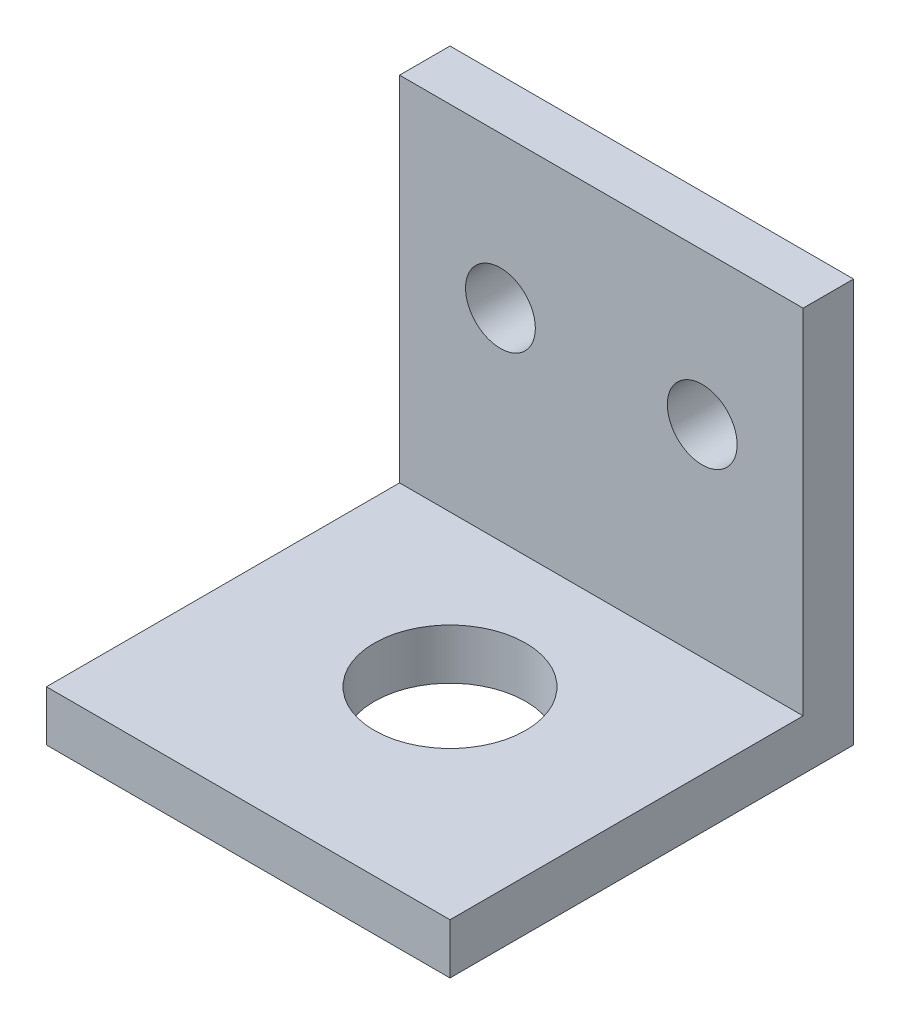
ISO-10303-21;
HEADER;
FILE_DESCRIPTION(('STEP AP214'),'2;1');
FILE_NAME('part.step','',(''),(''),'','','');
FILE_SCHEMA(('AUTOMOTIVE_DESIGN { 1 0 10303 214 1 1 1 1 }'));
ENDSEC;
DATA;
#1=APPLICATION_CONTEXT('core data for automotive mechanical design processes');
#2=APPLICATION_PROTOCOL_DEFINITION('international standard','automotive_design',2000,#1);
#3=PRODUCT_CONTEXT('',#1,'mechanical');
#4=PRODUCT('Part','Part','',(#3));
#5=PRODUCT_RELATED_PRODUCT_CATEGORY('part','',(#4));
#6=PRODUCT_DEFINITION_FORMATION('','',#4);
#7=PRODUCT_DEFINITION_CONTEXT('part definition',#1,'design');
#8=PRODUCT_DEFINITION('design','',#6,#7);
#9=PRODUCT_DEFINITION_SHAPE('','',#8);
#10=(LENGTH_UNIT() NAMED_UNIT(*) SI_UNIT(.MILLI.,.METRE.));
#11=(NAMED_UNIT(*) PLANE_ANGLE_UNIT() SI_UNIT($,.RADIAN.));
#12=(NAMED_UNIT(*) SI_UNIT($,.STERADIAN.) SOLID_ANGLE_UNIT());
#13=UNCERTAINTY_MEASURE_WITH_UNIT(LENGTH_MEASURE(1.E-05),#10,'distance_accuracy_value','');
#14=(GEOMETRIC_REPRESENTATION_CONTEXT(3) GLOBAL_UNCERTAINTY_ASSIGNED_CONTEXT((#13)) GLOBAL_UNIT_ASSIGNED_CONTEXT((#10,
#11,#12)) REPRESENTATION_CONTEXT('',''));
#15=CARTESIAN_POINT('',(0.,0.,0.));
#16=DIRECTION('',(0.,0.,1.));
#17=DIRECTION('',(1.,0.,0.));
#18=AXIS2_PLACEMENT_3D('',#15,#16,#17);
#19=CARTESIAN_POINT('',(-12.7,3.175,12.7));
#20=DIRECTION('',(-1.,0.,0.));
#21=DIRECTION('',(0.,0.,1.));
#22=AXIS2_PLACEMENT_3D('',#19,#20,#21);
#23=PLANE('',#22);
#24=DIRECTION('',(0.,0.,-1.));
#25=VECTOR('',#24,1.);
#26=CARTESIAN_POINT('',(-12.7,3.175,12.7));
#27=LINE('',#26,#25);
#28=CARTESIAN_POINT('',(-12.7,3.175,12.7));
#29=VERTEX_POINT('',#28);
#30=CARTESIAN_POINT('',(-12.7,3.175,-9.525));
#31=VERTEX_POINT('',#30);
#32=EDGE_CURVE('E86',#29,#31,#27,.T.);
#33=ORIENTED_EDGE('',*,*,#32,.T.);
#34=DIRECTION('',(0.,-1.,0.));
#35=VECTOR('',#34,1.);
#36=CARTESIAN_POINT('',(-12.7,25.4,-9.52500000000001));
#37=LINE('',#36,#35);
#38=CARTESIAN_POINT('',(-12.7,25.4,-9.52500000000001));
#39=VERTEX_POINT('',#38);
#40=EDGE_CURVE('E48',#39,#31,#37,.T.);
#41=ORIENTED_EDGE('',*,*,#40,.F.);
#42=DIRECTION('',(0.,0.,-1.));
#43=VECTOR('',#42,1.);
#44=CARTESIAN_POINT('',(-12.7,25.4,-12.7));
#45=LINE('',#44,#43);
#46=CARTESIAN_POINT('',(-12.7,25.4,-12.7));
#47=VERTEX_POINT('',#46);
#48=EDGE_CURVE('E117',#39,#47,#45,.T.);
#49=ORIENTED_EDGE('',*,*,#48,.T.);
#50=DIRECTION('',(0.,-1.,0.));
#51=VECTOR('',#50,1.);
#52=CARTESIAN_POINT('',(-12.7,3.175,-12.7));
#53=LINE('',#52,#51);
#54=CARTESIAN_POINT('',(-12.7,0.,-12.7));
#55=VERTEX_POINT('',#54);
#56=EDGE_CURVE('E35',#47,#55,#53,.T.);
#57=ORIENTED_EDGE('',*,*,#56,.T.);
#58=DIRECTION('',(0.,0.,-1.));
#59=VECTOR('',#58,1.);
#60=CARTESIAN_POINT('',(-12.7,0.,12.7));
#61=LINE('',#60,#59);
#62=CARTESIAN_POINT('',(-12.7,0.,12.7));
#63=VERTEX_POINT('',#62);
#64=EDGE_CURVE('E83',#63,#55,#61,.T.);
#65=ORIENTED_EDGE('',*,*,#64,.F.);
#66=DIRECTION('',(0.,-1.,0.));
#67=VECTOR('',#66,1.);
#68=CARTESIAN_POINT('',(-12.7,3.175,12.7));
#69=LINE('',#68,#67);
#70=EDGE_CURVE('E11',#29,#63,#69,.T.);
#71=ORIENTED_EDGE('',*,*,#70,.F.);
#72=EDGE_LOOP('',(#33,#41,#49,#57,#65,#71));
#73=FACE_BOUND('',#72,.T.);
#74=ADVANCED_FACE('F32',(#73),#23,.T.);
#75=CARTESIAN_POINT('',(-12.7,3.175,12.7));
#76=DIRECTION('',(0.,0.,-1.));
#77=DIRECTION('',(-1.,0.,0.));
#78=AXIS2_PLACEMENT_3D('',#75,#76,#77);
#79=PLANE('',#78);
#80=DIRECTION('',(1.,0.,0.));
#81=VECTOR('',#80,1.);
#82=CARTESIAN_POINT('',(-12.7,0.,12.7));
#83=LINE('',#82,#81);
#84=CARTESIAN_POINT('',(12.7,0.,12.7));
#85=VERTEX_POINT('',#84);
#86=EDGE_CURVE('E75',#63,#85,#83,.T.);
#87=ORIENTED_EDGE('',*,*,#86,.T.);
#88=DIRECTION('',(0.,-1.,0.));
#89=VECTOR('',#88,1.);
#90=CARTESIAN_POINT('',(12.7,3.175,12.7));
#91=LINE('',#90,#89);
#92=CARTESIAN_POINT('',(12.7,3.175,12.7));
#93=VERTEX_POINT('',#92);
#94=EDGE_CURVE('E40',#93,#85,#91,.T.);
#95=ORIENTED_EDGE('',*,*,#94,.F.);
#96=DIRECTION('',(1.,0.,0.));
#97=VECTOR('',#96,1.);
#98=CARTESIAN_POINT('',(-12.7,3.175,12.7));
#99=LINE('',#98,#97);
#100=EDGE_CURVE('E77',#29,#93,#99,.T.);
#101=ORIENTED_EDGE('',*,*,#100,.F.);
#102=ORIENTED_EDGE('',*,*,#70,.T.);
#103=EDGE_LOOP('',(#87,#95,#101,#102));
#104=FACE_BOUND('',#103,.T.);
#105=ADVANCED_FACE('F73',(#104),#79,.F.);
#106=CARTESIAN_POINT('',(12.7,3.175,12.7));
#107=DIRECTION('',(-1.,0.,0.));
#108=DIRECTION('',(0.,0.,1.));
#109=AXIS2_PLACEMENT_3D('',#106,#107,#108);
#110=PLANE('',#109);
#111=DIRECTION('',(0.,0.,-1.));
#112=VECTOR('',#111,1.);
#113=CARTESIAN_POINT('',(12.7,0.,12.7));
#114=LINE('',#113,#112);
#115=CARTESIAN_POINT('',(12.7,0.,-12.7));
#116=VERTEX_POINT('',#115);
#117=EDGE_CURVE('E85',#85,#116,#114,.T.);
#118=ORIENTED_EDGE('',*,*,#117,.T.);
#119=DIRECTION('',(0.,-1.,0.));
#120=VECTOR('',#119,1.);
#121=CARTESIAN_POINT('',(12.7,3.175,-12.7));
#122=LINE('',#121,#120);
#123=CARTESIAN_POINT('',(12.7,25.4,-12.7));
#124=VERTEX_POINT('',#123);
#125=EDGE_CURVE('E100',#124,#116,#122,.T.);
#126=ORIENTED_EDGE('',*,*,#125,.F.);
#127=DIRECTION('',(0.,0.,1.));
#128=VECTOR('',#127,1.);
#129=CARTESIAN_POINT('',(12.7,25.4,-12.7));
#130=LINE('',#129,#128);
#131=CARTESIAN_POINT('',(12.7,25.4,-9.525));
#132=VERTEX_POINT('',#131);
#133=EDGE_CURVE('E121',#124,#132,#130,.T.);
#134=ORIENTED_EDGE('',*,*,#133,.T.);
#135=DIRECTION('',(0.,-1.,0.));
#136=VECTOR('',#135,1.);
#137=CARTESIAN_POINT('',(12.7,25.4,-9.525));
#138=LINE('',#137,#136);
#139=CARTESIAN_POINT('',(12.7,3.175,-9.525));
#140=VERTEX_POINT('',#139);
#141=EDGE_CURVE('E111',#132,#140,#138,.T.);
#142=ORIENTED_EDGE('',*,*,#141,.T.);
#143=DIRECTION('',(0.,0.,-1.));
#144=VECTOR('',#143,1.);
#145=CARTESIAN_POINT('',(12.7,3.175,12.7));
#146=LINE('',#145,#144);
#147=EDGE_CURVE('E105',#93,#140,#146,.T.);
#148=ORIENTED_EDGE('',*,*,#147,.F.);
#149=ORIENTED_EDGE('',*,*,#94,.T.);
#150=EDGE_LOOP('',(#118,#126,#134,#142,#148,#149));
#151=FACE_BOUND('',#150,.T.);
#152=ADVANCED_FACE('F164',(#151),#110,.F.);
#153=CARTESIAN_POINT('',(-12.7,3.175,-12.7));
#154=DIRECTION('',(0.,0.,-1.));
#155=DIRECTION('',(-1.,0.,0.));
#156=AXIS2_PLACEMENT_3D('',#153,#154,#155);
#157=PLANE('',#156);
#158=CARTESIAN_POINT('',(-6.35,15.875,-12.7));
#159=DIRECTION('',(0.,0.,1.));
#160=DIRECTION('',(1.,0.,0.));
#161=AXIS2_PLACEMENT_3D('',#158,#159,#160);
#162=CIRCLE('',#161,2.1971);
#163=CARTESIAN_POINT('',(-4.1529,15.875,-12.7));
#164=VERTEX_POINT('',#163);
#165=EDGE_CURVE('E128',#164,#164,#162,.T.);
#166=ORIENTED_EDGE('',*,*,#165,.T.);
#167=EDGE_LOOP('',(#166));
#168=FACE_BOUND('',#167,.T.);
#169=CARTESIAN_POINT('',(6.35,15.875,-12.7));
#170=DIRECTION('',(0.,0.,1.));
#171=DIRECTION('',(-1.,0.,0.));
#172=AXIS2_PLACEMENT_3D('',#169,#170,#171);
#173=CIRCLE('',#172,2.1971);
#174=CARTESIAN_POINT('',(4.1529,15.875,-12.7));
#175=VERTEX_POINT('',#174);
#176=EDGE_CURVE('E134',#175,#175,#173,.T.);
#177=ORIENTED_EDGE('',*,*,#176,.T.);
#178=EDGE_LOOP('',(#177));
#179=FACE_BOUND('',#178,.T.);
#180=DIRECTION('',(1.,0.,0.));
#181=VECTOR('',#180,1.);
#182=CARTESIAN_POINT('',(-12.7,0.,-12.7));
#183=LINE('',#182,#181);
#184=EDGE_CURVE('E91',#55,#116,#183,.T.);
#185=ORIENTED_EDGE('',*,*,#184,.F.);
#186=ORIENTED_EDGE('',*,*,#56,.F.);
#187=DIRECTION('',(1.,0.,0.));
#188=VECTOR('',#187,1.);
#189=CARTESIAN_POINT('',(12.7,25.4,-12.7));
#190=LINE('',#189,#188);
#191=EDGE_CURVE('E114',#47,#124,#190,.T.);
#192=ORIENTED_EDGE('',*,*,#191,.T.);
#193=ORIENTED_EDGE('',*,*,#125,.T.);
#194=EDGE_LOOP('',(#185,#186,#192,#193));
#195=FACE_BOUND('',#194,.T.);
#196=ADVANCED_FACE('F143',(#168,#179,#195),#157,.T.);
#197=CARTESIAN_POINT('',(0.,3.175,0.));
#198=DIRECTION('',(0.,-1.,0.));
#199=DIRECTION('',(0.,0.,-1.));
#200=AXIS2_PLACEMENT_3D('',#197,#198,#199);
#201=PLANE('',#200);
#202=CARTESIAN_POINT('',(0.,3.175,0.));
#203=DIRECTION('',(0.,1.,0.));
#204=DIRECTION('',(0.,0.,1.));
#205=AXIS2_PLACEMENT_3D('',#202,#203,#204);
#206=CIRCLE('',#205,4.7625);
#207=CARTESIAN_POINT('',(0.,3.175,4.7625));
#208=VERTEX_POINT('',#207);
#209=EDGE_CURVE('E125',#208,#208,#206,.T.);
#210=ORIENTED_EDGE('',*,*,#209,.F.);
#211=EDGE_LOOP('',(#210));
#212=FACE_BOUND('',#211,.T.);
#213=ORIENTED_EDGE('',*,*,#147,.T.);
#214=DIRECTION('',(-1.,0.,0.));
#215=VECTOR('',#214,1.);
#216=CARTESIAN_POINT('',(0.,3.175,-9.525));
#217=LINE('',#216,#215);
#218=EDGE_CURVE('E92',#140,#31,#217,.T.);
#219=ORIENTED_EDGE('',*,*,#218,.T.);
#220=ORIENTED_EDGE('',*,*,#32,.F.);
#221=ORIENTED_EDGE('',*,*,#100,.T.);
#222=EDGE_LOOP('',(#213,#219,#220,#221));
#223=FACE_BOUND('',#222,.T.);
#224=ADVANCED_FACE('F175',(#212,#223),#201,.F.);
#225=CARTESIAN_POINT('',(0.,0.,0.));
#226=DIRECTION('',(0.,-1.,0.));
#227=DIRECTION('',(0.,0.,-1.));
#228=AXIS2_PLACEMENT_3D('',#225,#226,#227);
#229=PLANE('',#228);
#230=CARTESIAN_POINT('',(0.,0.,0.));
#231=DIRECTION('',(0.,1.,0.));
#232=DIRECTION('',(0.,0.,1.));
#233=AXIS2_PLACEMENT_3D('',#230,#231,#232);
#234=CIRCLE('',#233,4.7625);
#235=CARTESIAN_POINT('',(0.,0.,4.7625));
#236=VERTEX_POINT('',#235);
#237=EDGE_CURVE('E124',#236,#236,#234,.T.);
#238=ORIENTED_EDGE('',*,*,#237,.T.);
#239=EDGE_LOOP('',(#238));
#240=FACE_BOUND('',#239,.T.);
#241=ORIENTED_EDGE('',*,*,#64,.T.);
#242=ORIENTED_EDGE('',*,*,#184,.T.);
#243=ORIENTED_EDGE('',*,*,#117,.F.);
#244=ORIENTED_EDGE('',*,*,#86,.F.);
#245=EDGE_LOOP('',(#241,#242,#243,#244));
#246=FACE_BOUND('',#245,.T.);
#247=ADVANCED_FACE('F81',(#240,#246),#229,.T.);
#248=CARTESIAN_POINT('',(12.7,25.4,-9.525));
#249=DIRECTION('',(0.,0.,1.));
#250=DIRECTION('',(1.,0.,0.));
#251=AXIS2_PLACEMENT_3D('',#248,#249,#250);
#252=PLANE('',#251);
#253=CARTESIAN_POINT('',(-6.35,15.875,-9.525));
#254=DIRECTION('',(0.,0.,1.));
#255=DIRECTION('',(1.,0.,0.));
#256=AXIS2_PLACEMENT_3D('',#253,#254,#255);
#257=CIRCLE('',#256,2.1971);
#258=CARTESIAN_POINT('',(-4.1529,15.875,-9.525));
#259=VERTEX_POINT('',#258);
#260=EDGE_CURVE('E137',#259,#259,#257,.T.);
#261=ORIENTED_EDGE('',*,*,#260,.F.);
#262=EDGE_LOOP('',(#261));
#263=FACE_BOUND('',#262,.T.);
#264=CARTESIAN_POINT('',(6.35,15.875,-9.525));
#265=DIRECTION('',(0.,0.,1.));
#266=DIRECTION('',(-1.,0.,0.));
#267=AXIS2_PLACEMENT_3D('',#264,#265,#266);
#268=CIRCLE('',#267,2.1971);
#269=CARTESIAN_POINT('',(4.1529,15.875,-9.525));
#270=VERTEX_POINT('',#269);
#271=EDGE_CURVE('E131',#270,#270,#268,.T.);
#272=ORIENTED_EDGE('',*,*,#271,.F.);
#273=EDGE_LOOP('',(#272));
#274=FACE_BOUND('',#273,.T.);
#275=ORIENTED_EDGE('',*,*,#218,.F.);
#276=ORIENTED_EDGE('',*,*,#141,.F.);
#277=DIRECTION('',(-1.,0.,0.));
#278=VECTOR('',#277,1.);
#279=CARTESIAN_POINT('',(12.7,25.4,-9.525));
#280=LINE('',#279,#278);
#281=EDGE_CURVE('E119',#132,#39,#280,.T.);
#282=ORIENTED_EDGE('',*,*,#281,.T.);
#283=ORIENTED_EDGE('',*,*,#40,.T.);
#284=EDGE_LOOP('',(#275,#276,#282,#283));
#285=FACE_BOUND('',#284,.T.);
#286=ADVANCED_FACE('F153',(#263,#274,#285),#252,.T.);
#287=CARTESIAN_POINT('',(0.,25.4,0.));
#288=DIRECTION('',(0.,-1.,0.));
#289=DIRECTION('',(0.,0.,-1.));
#290=AXIS2_PLACEMENT_3D('',#287,#288,#289);
#291=PLANE('',#290);
#292=ORIENTED_EDGE('',*,*,#133,.F.);
#293=ORIENTED_EDGE('',*,*,#191,.F.);
#294=ORIENTED_EDGE('',*,*,#48,.F.);
#295=ORIENTED_EDGE('',*,*,#281,.F.);
#296=EDGE_LOOP('',(#292,#293,#294,#295));
#297=FACE_BOUND('',#296,.T.);
#298=ADVANCED_FACE('F156',(#297),#291,.F.);
#299=CARTESIAN_POINT('',(0.,0.,0.));
#300=DIRECTION('',(0.,1.,0.));
#301=DIRECTION('',(0.,0.,1.));
#302=AXIS2_PLACEMENT_3D('',#299,#300,#301);
#303=CYLINDRICAL_SURFACE('',#302,4.7625);
#304=ORIENTED_EDGE('',*,*,#237,.F.);
#305=EDGE_LOOP('',(#304));
#306=FACE_BOUND('',#305,.T.);
#307=ORIENTED_EDGE('',*,*,#209,.T.);
#308=EDGE_LOOP('',(#307));
#309=FACE_BOUND('',#308,.T.);
#310=ADVANCED_FACE('F210',(#306,#309),#303,.F.);
#311=CARTESIAN_POINT('',(6.35,15.875,-12.7));
#312=DIRECTION('',(0.,0.,1.));
#313=DIRECTION('',(1.,0.,0.));
#314=AXIS2_PLACEMENT_3D('',#311,#312,#313);
#315=CYLINDRICAL_SURFACE('',#314,2.1971);
#316=ORIENTED_EDGE('',*,*,#176,.F.);
#317=EDGE_LOOP('',(#316));
#318=FACE_BOUND('',#317,.T.);
#319=ORIENTED_EDGE('',*,*,#271,.T.);
#320=EDGE_LOOP('',(#319));
#321=FACE_BOUND('',#320,.T.);
#322=ADVANCED_FACE('F149',(#318,#321),#315,.F.);
#323=CARTESIAN_POINT('',(-6.35,15.875,-12.7));
#324=DIRECTION('',(0.,0.,1.));
#325=DIRECTION('',(1.,0.,0.));
#326=AXIS2_PLACEMENT_3D('',#323,#324,#325);
#327=CYLINDRICAL_SURFACE('',#326,2.1971);
#328=ORIENTED_EDGE('',*,*,#165,.F.);
#329=EDGE_LOOP('',(#328));
#330=FACE_BOUND('',#329,.T.);
#331=ORIENTED_EDGE('',*,*,#260,.T.);
#332=EDGE_LOOP('',(#331));
#333=FACE_BOUND('',#332,.T.);
#334=ADVANCED_FACE('F146',(#330,#333),#327,.F.);
#335=CLOSED_SHELL('',(#74,#105,#152,#196,#224,#247,#286,#298,#310,#322,#334));
#336=MANIFOLD_SOLID_BREP('B2',#335);
#337=ADVANCED_BREP_SHAPE_REPRESENTATION('',(#18,#336),#14);
#338=SHAPE_DEFINITION_REPRESENTATION(#9,#337);
ENDSEC;
END-ISO-10303-21;
